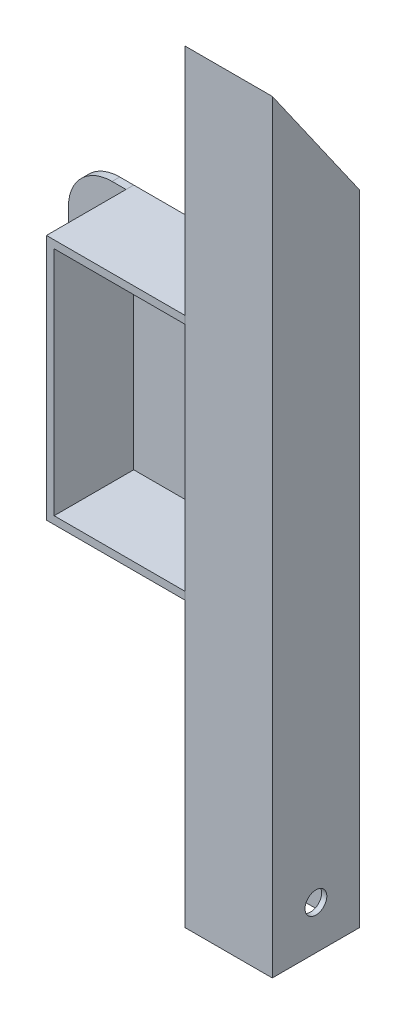
ISO-10303-21;
HEADER;
FILE_DESCRIPTION(('STEP AP214'),'2;1');
FILE_NAME('part.step','',(''),(''),'','','');
FILE_SCHEMA(('AUTOMOTIVE_DESIGN { 1 0 10303 214 1 1 1 1 }'));
ENDSEC;
DATA;
#1=APPLICATION_CONTEXT('core data for automotive mechanical design processes');
#2=APPLICATION_PROTOCOL_DEFINITION('international standard','automotive_design',2000,#1);
#3=PRODUCT_CONTEXT('',#1,'mechanical');
#4=PRODUCT('Part','Part','',(#3));
#5=PRODUCT_RELATED_PRODUCT_CATEGORY('part','',(#4));
#6=PRODUCT_DEFINITION_FORMATION('','',#4);
#7=PRODUCT_DEFINITION_CONTEXT('part definition',#1,'design');
#8=PRODUCT_DEFINITION('design','',#6,#7);
#9=PRODUCT_DEFINITION_SHAPE('','',#8);
#10=(LENGTH_UNIT() NAMED_UNIT(*) SI_UNIT(.MILLI.,.METRE.));
#11=(NAMED_UNIT(*) PLANE_ANGLE_UNIT() SI_UNIT($,.RADIAN.));
#12=(NAMED_UNIT(*) SI_UNIT($,.STERADIAN.) SOLID_ANGLE_UNIT());
#13=UNCERTAINTY_MEASURE_WITH_UNIT(LENGTH_MEASURE(1.E-05),#10,'distance_accuracy_value','');
#14=(GEOMETRIC_REPRESENTATION_CONTEXT(3) GLOBAL_UNCERTAINTY_ASSIGNED_CONTEXT((#13)) GLOBAL_UNIT_ASSIGNED_CONTEXT((#10,
#11,#12)) REPRESENTATION_CONTEXT('',''));
#15=CARTESIAN_POINT('',(0.,0.,0.));
#16=DIRECTION('',(0.,0.,1.));
#17=DIRECTION('',(1.,0.,0.));
#18=AXIS2_PLACEMENT_3D('',#15,#16,#17);
#19=CARTESIAN_POINT('',(-40.3352,154.3304,-23.1648));
#20=DIRECTION('',(1.,0.,0.));
#21=DIRECTION('',(0.,1.,0.));
#22=AXIS2_PLACEMENT_3D('',#19,#20,#21);
#23=PLANE('',#22);
#24=DIRECTION('',(0.,-1.,0.));
#25=VECTOR('',#24,1.);
#26=CARTESIAN_POINT('',(-40.3352,154.3304,-25.4));
#27=LINE('',#26,#25);
#28=CARTESIAN_POINT('',(-40.3352,154.3304,-25.4));
#29=VERTEX_POINT('',#28);
#30=CARTESIAN_POINT('',(-40.3352,82.55,-25.4));
#31=VERTEX_POINT('',#30);
#32=EDGE_CURVE('E135',#29,#31,#27,.T.);
#33=ORIENTED_EDGE('',*,*,#32,.F.);
#34=DIRECTION('',(0.,0.,-1.));
#35=VECTOR('',#34,1.);
#36=CARTESIAN_POINT('',(-40.3352,154.3304,-23.1648));
#37=LINE('',#36,#35);
#38=CARTESIAN_POINT('',(-40.3352,154.3304,-23.1648));
#39=VERTEX_POINT('',#38);
#40=EDGE_CURVE('E12',#39,#29,#37,.T.);
#41=ORIENTED_EDGE('',*,*,#40,.F.);
#42=DIRECTION('',(0.,-1.,0.));
#43=VECTOR('',#42,1.);
#44=CARTESIAN_POINT('',(-40.3352,154.3304,-23.1648));
#45=LINE('',#44,#43);
#46=CARTESIAN_POINT('',(-40.3352,82.55,-23.1648));
#47=VERTEX_POINT('',#46);
#48=EDGE_CURVE('E150',#39,#47,#45,.T.);
#49=ORIENTED_EDGE('',*,*,#48,.T.);
#50=DIRECTION('',(0.,0.,-1.));
#51=VECTOR('',#50,1.);
#52=CARTESIAN_POINT('',(-40.3352,82.55,-23.1648));
#53=LINE('',#52,#51);
#54=EDGE_CURVE('E53',#47,#31,#53,.T.);
#55=ORIENTED_EDGE('',*,*,#54,.T.);
#56=EDGE_LOOP('',(#33,#41,#49,#55));
#57=FACE_BOUND('',#56,.T.);
#58=ADVANCED_FACE('F50',(#57),#23,.T.);
#59=CARTESIAN_POINT('',(-40.3352,154.3304,-23.1648));
#60=DIRECTION('',(0.,1.,0.));
#61=DIRECTION('',(0.,0.,1.));
#62=AXIS2_PLACEMENT_3D('',#59,#60,#61);
#63=PLANE('',#62);
#64=DIRECTION('',(1.,0.,0.));
#65=VECTOR('',#64,1.);
#66=CARTESIAN_POINT('',(-40.3352,154.3304,-25.4));
#67=LINE('',#66,#65);
#68=CARTESIAN_POINT('',(-44.3991999999999,154.3304,-25.4));
#69=VERTEX_POINT('',#68);
#70=EDGE_CURVE('E148',#69,#29,#67,.T.);
#71=ORIENTED_EDGE('',*,*,#70,.F.);
#72=DIRECTION('',(0.,0.,-1.));
#73=VECTOR('',#72,1.);
#74=CARTESIAN_POINT('',(-44.3991999999999,154.3304,-23.1648));
#75=LINE('',#74,#73);
#76=CARTESIAN_POINT('',(-44.3991999999999,154.3304,-23.1648));
#77=VERTEX_POINT('',#76);
#78=EDGE_CURVE('E59',#77,#69,#75,.T.);
#79=ORIENTED_EDGE('',*,*,#78,.F.);
#80=DIRECTION('',(1.,0.,0.));
#81=VECTOR('',#80,1.);
#82=CARTESIAN_POINT('',(-40.3352,154.3304,-23.1648));
#83=LINE('',#82,#81);
#84=EDGE_CURVE('E125',#77,#39,#83,.T.);
#85=ORIENTED_EDGE('',*,*,#84,.T.);
#86=ORIENTED_EDGE('',*,*,#40,.T.);
#87=EDGE_LOOP('',(#71,#79,#85,#86));
#88=FACE_BOUND('',#87,.T.);
#89=ADVANCED_FACE('F158',(#88),#63,.T.);
#90=CARTESIAN_POINT('',(-44.3992,141.6304,-23.1648));
#91=DIRECTION('',(0.,0.,-1.));
#92=DIRECTION('',(-1.,0.,0.));
#93=AXIS2_PLACEMENT_3D('',#90,#91,#92);
#94=CYLINDRICAL_SURFACE('',#93,12.7);
#95=CARTESIAN_POINT('',(-44.3992,141.6304,-25.4));
#96=DIRECTION('',(0.,0.,-1.));
#97=DIRECTION('',(-1.,0.,0.));
#98=AXIS2_PLACEMENT_3D('',#95,#96,#97);
#99=CIRCLE('',#98,12.7);
#100=CARTESIAN_POINT('',(-57.0991999999999,141.6304,-25.4));
#101=VERTEX_POINT('',#100);
#102=EDGE_CURVE('E112',#101,#69,#99,.T.);
#103=ORIENTED_EDGE('',*,*,#102,.F.);
#104=DIRECTION('',(0.,0.,-1.));
#105=VECTOR('',#104,1.);
#106=CARTESIAN_POINT('',(-57.0991999999999,141.6304,-23.1648));
#107=LINE('',#106,#105);
#108=CARTESIAN_POINT('',(-57.0991999999999,141.6304,-23.1648));
#109=VERTEX_POINT('',#108);
#110=EDGE_CURVE('E107',#109,#101,#107,.T.);
#111=ORIENTED_EDGE('',*,*,#110,.F.);
#112=CARTESIAN_POINT('',(-44.3992,141.6304,-23.1648));
#113=DIRECTION('',(0.,0.,-1.));
#114=DIRECTION('',(-1.,0.,0.));
#115=AXIS2_PLACEMENT_3D('',#112,#113,#114);
#116=CIRCLE('',#115,12.7);
#117=EDGE_CURVE('E110',#109,#77,#116,.T.);
#118=ORIENTED_EDGE('',*,*,#117,.T.);
#119=ORIENTED_EDGE('',*,*,#78,.T.);
#120=EDGE_LOOP('',(#103,#111,#118,#119));
#121=FACE_BOUND('',#120,.T.);
#122=ADVANCED_FACE('F109',(#121),#94,.T.);
#123=CARTESIAN_POINT('',(-57.0992,141.6304,-23.1648));
#124=DIRECTION('',(-1.,0.,0.));
#125=DIRECTION('',(0.,-1.,0.));
#126=AXIS2_PLACEMENT_3D('',#123,#124,#125);
#127=PLANE('',#126);
#128=DIRECTION('',(0.,1.,0.));
#129=VECTOR('',#128,1.);
#130=CARTESIAN_POINT('',(-57.0992,141.6304,-25.4));
#131=LINE('',#130,#129);
#132=CARTESIAN_POINT('',(-57.0992,95.2500000000001,-25.4));
#133=VERTEX_POINT('',#132);
#134=EDGE_CURVE('E145',#133,#101,#131,.T.);
#135=ORIENTED_EDGE('',*,*,#134,.F.);
#136=DIRECTION('',(0.,0.,-1.));
#137=VECTOR('',#136,1.);
#138=CARTESIAN_POINT('',(-57.0992,95.2500000000001,-23.1648));
#139=LINE('',#138,#137);
#140=CARTESIAN_POINT('',(-57.0992,95.2500000000001,-23.1648));
#141=VERTEX_POINT('',#140);
#142=EDGE_CURVE('E117',#141,#133,#139,.T.);
#143=ORIENTED_EDGE('',*,*,#142,.F.);
#144=DIRECTION('',(0.,1.,0.));
#145=VECTOR('',#144,1.);
#146=CARTESIAN_POINT('',(-57.0992,141.6304,-23.1648));
#147=LINE('',#146,#145);
#148=EDGE_CURVE('E123',#141,#109,#147,.T.);
#149=ORIENTED_EDGE('',*,*,#148,.T.);
#150=ORIENTED_EDGE('',*,*,#110,.T.);
#151=EDGE_LOOP('',(#135,#143,#149,#150));
#152=FACE_BOUND('',#151,.T.);
#153=ADVANCED_FACE('F127',(#152),#127,.T.);
#154=CARTESIAN_POINT('',(-44.3992,95.25,-23.1648));
#155=DIRECTION('',(0.,0.,-1.));
#156=DIRECTION('',(-1.,0.,0.));
#157=AXIS2_PLACEMENT_3D('',#154,#155,#156);
#158=CYLINDRICAL_SURFACE('',#157,12.7);
#159=CARTESIAN_POINT('',(-44.3992,95.25,-25.4));
#160=DIRECTION('',(0.,0.,-1.));
#161=DIRECTION('',(-1.,0.,0.));
#162=AXIS2_PLACEMENT_3D('',#159,#160,#161);
#163=CIRCLE('',#162,12.7);
#164=CARTESIAN_POINT('',(-44.3991999999999,82.55,-25.4));
#165=VERTEX_POINT('',#164);
#166=EDGE_CURVE('E142',#165,#133,#163,.T.);
#167=ORIENTED_EDGE('',*,*,#166,.F.);
#168=DIRECTION('',(0.,0.,-1.));
#169=VECTOR('',#168,1.);
#170=CARTESIAN_POINT('',(-44.3991999999999,82.55,-23.1648));
#171=LINE('',#170,#169);
#172=CARTESIAN_POINT('',(-44.3991999999999,82.55,-23.1648));
#173=VERTEX_POINT('',#172);
#174=EDGE_CURVE('E153',#173,#165,#171,.T.);
#175=ORIENTED_EDGE('',*,*,#174,.F.);
#176=CARTESIAN_POINT('',(-44.3992,95.25,-23.1648));
#177=DIRECTION('',(0.,0.,-1.));
#178=DIRECTION('',(-1.,0.,0.));
#179=AXIS2_PLACEMENT_3D('',#176,#177,#178);
#180=CIRCLE('',#179,12.7);
#181=EDGE_CURVE('E128',#173,#141,#180,.T.);
#182=ORIENTED_EDGE('',*,*,#181,.T.);
#183=ORIENTED_EDGE('',*,*,#142,.T.);
#184=EDGE_LOOP('',(#167,#175,#182,#183));
#185=FACE_BOUND('',#184,.T.);
#186=ADVANCED_FACE('F171',(#185),#158,.T.);
#187=CARTESIAN_POINT('',(-40.3352,82.55,-23.1648));
#188=DIRECTION('',(0.,-1.,0.));
#189=DIRECTION('',(0.,0.,-1.));
#190=AXIS2_PLACEMENT_3D('',#187,#188,#189);
#191=PLANE('',#190);
#192=DIRECTION('',(-1.,0.,0.));
#193=VECTOR('',#192,1.);
#194=CARTESIAN_POINT('',(-40.3352,82.55,-25.4));
#195=LINE('',#194,#193);
#196=EDGE_CURVE('E138',#31,#165,#195,.T.);
#197=ORIENTED_EDGE('',*,*,#196,.F.);
#198=ORIENTED_EDGE('',*,*,#54,.F.);
#199=DIRECTION('',(-1.,0.,0.));
#200=VECTOR('',#199,1.);
#201=CARTESIAN_POINT('',(-40.3352,82.55,-23.1648));
#202=LINE('',#201,#200);
#203=EDGE_CURVE('E130',#47,#173,#202,.T.);
#204=ORIENTED_EDGE('',*,*,#203,.T.);
#205=ORIENTED_EDGE('',*,*,#174,.T.);
#206=EDGE_LOOP('',(#197,#198,#204,#205));
#207=FACE_BOUND('',#206,.T.);
#208=ADVANCED_FACE('F155',(#207),#191,.T.);
#209=CARTESIAN_POINT('',(-44.3992,95.25,-23.1648));
#210=DIRECTION('',(0.,0.,-1.));
#211=DIRECTION('',(-1.,0.,0.));
#212=AXIS2_PLACEMENT_3D('',#209,#210,#211);
#213=PLANE('',#212);
#214=CARTESIAN_POINT('',(-48.7172,92.1004,-23.1648));
#215=DIRECTION('',(0.,0.,-1.));
#216=DIRECTION('',(-1.,0.,0.));
#217=AXIS2_PLACEMENT_3D('',#214,#215,#216);
#218=CIRCLE('',#217,1.15570000000001);
#219=CARTESIAN_POINT('',(-49.8729,92.1004,-23.1648));
#220=VERTEX_POINT('',#219);
#221=EDGE_CURVE('E209',#220,#220,#218,.T.);
#222=ORIENTED_EDGE('',*,*,#221,.T.);
#223=EDGE_LOOP('',(#222));
#224=FACE_BOUND('',#223,.T.);
#225=CARTESIAN_POINT('',(-48.7172,104.8004,-23.1648));
#226=DIRECTION('',(0.,0.,-1.));
#227=DIRECTION('',(-1.,0.,0.));
#228=AXIS2_PLACEMENT_3D('',#225,#226,#227);
#229=CIRCLE('',#228,1.15570000000001);
#230=CARTESIAN_POINT('',(-49.8729,104.8004,-23.1648));
#231=VERTEX_POINT('',#230);
#232=EDGE_CURVE('E217',#231,#231,#229,.T.);
#233=ORIENTED_EDGE('',*,*,#232,.T.);
#234=EDGE_LOOP('',(#233));
#235=FACE_BOUND('',#234,.T.);
#236=CARTESIAN_POINT('',(-48.7172,117.5004,-23.1648));
#237=DIRECTION('',(0.,0.,-1.));
#238=DIRECTION('',(-1.,0.,0.));
#239=AXIS2_PLACEMENT_3D('',#236,#237,#238);
#240=CIRCLE('',#239,1.15570000000001);
#241=CARTESIAN_POINT('',(-49.8729,117.5004,-23.1648));
#242=VERTEX_POINT('',#241);
#243=EDGE_CURVE('E223',#242,#242,#240,.T.);
#244=ORIENTED_EDGE('',*,*,#243,.T.);
#245=EDGE_LOOP('',(#244));
#246=FACE_BOUND('',#245,.T.);
#247=CARTESIAN_POINT('',(-48.7172,130.2004,-23.1648));
#248=DIRECTION('',(0.,0.,-1.));
#249=DIRECTION('',(-1.,0.,0.));
#250=AXIS2_PLACEMENT_3D('',#247,#248,#249);
#251=CIRCLE('',#250,1.15570000000001);
#252=CARTESIAN_POINT('',(-49.8729,130.2004,-23.1648));
#253=VERTEX_POINT('',#252);
#254=EDGE_CURVE('E229',#253,#253,#251,.T.);
#255=ORIENTED_EDGE('',*,*,#254,.T.);
#256=EDGE_LOOP('',(#255));
#257=FACE_BOUND('',#256,.T.);
#258=CARTESIAN_POINT('',(-48.7172,142.9004,-23.1648));
#259=DIRECTION('',(0.,0.,-1.));
#260=DIRECTION('',(-1.,0.,0.));
#261=AXIS2_PLACEMENT_3D('',#258,#259,#260);
#262=CIRCLE('',#261,1.15570000000001);
#263=CARTESIAN_POINT('',(-49.8729,142.9004,-23.1648));
#264=VERTEX_POINT('',#263);
#265=EDGE_CURVE('E139',#264,#264,#262,.T.);
#266=ORIENTED_EDGE('',*,*,#265,.T.);
#267=EDGE_LOOP('',(#266));
#268=FACE_BOUND('',#267,.T.);
#269=ORIENTED_EDGE('',*,*,#48,.F.);
#270=ORIENTED_EDGE('',*,*,#84,.F.);
#271=ORIENTED_EDGE('',*,*,#117,.F.);
#272=ORIENTED_EDGE('',*,*,#148,.F.);
#273=ORIENTED_EDGE('',*,*,#181,.F.);
#274=ORIENTED_EDGE('',*,*,#203,.F.);
#275=EDGE_LOOP('',(#269,#270,#271,#272,#273,#274));
#276=FACE_BOUND('',#275,.T.);
#277=ADVANCED_FACE('F121',(#224,#235,#246,#257,#268,#276),#213,.F.);
#278=CARTESIAN_POINT('',(-44.3992,95.25,-25.4));
#279=DIRECTION('',(0.,0.,-1.));
#280=DIRECTION('',(-1.,0.,0.));
#281=AXIS2_PLACEMENT_3D('',#278,#279,#280);
#282=PLANE('',#281);
#283=CARTESIAN_POINT('',(-48.7172,92.1004,-25.4));
#284=DIRECTION('',(0.,0.,-1.));
#285=DIRECTION('',(-1.,0.,0.));
#286=AXIS2_PLACEMENT_3D('',#283,#284,#285);
#287=CIRCLE('',#286,1.15570000000001);
#288=CARTESIAN_POINT('',(-49.8729,92.1004,-25.4));
#289=VERTEX_POINT('',#288);
#290=EDGE_CURVE('E212',#289,#289,#287,.T.);
#291=ORIENTED_EDGE('',*,*,#290,.F.);
#292=EDGE_LOOP('',(#291));
#293=FACE_BOUND('',#292,.T.);
#294=CARTESIAN_POINT('',(-48.7172,104.8004,-25.4));
#295=DIRECTION('',(0.,0.,-1.));
#296=DIRECTION('',(-1.,0.,0.));
#297=AXIS2_PLACEMENT_3D('',#294,#295,#296);
#298=CIRCLE('',#297,1.15570000000001);
#299=CARTESIAN_POINT('',(-49.8729,104.8004,-25.4));
#300=VERTEX_POINT('',#299);
#301=EDGE_CURVE('E214',#300,#300,#298,.T.);
#302=ORIENTED_EDGE('',*,*,#301,.F.);
#303=EDGE_LOOP('',(#302));
#304=FACE_BOUND('',#303,.T.);
#305=CARTESIAN_POINT('',(-48.7172,117.5004,-25.4));
#306=DIRECTION('',(0.,0.,-1.));
#307=DIRECTION('',(-1.,0.,0.));
#308=AXIS2_PLACEMENT_3D('',#305,#306,#307);
#309=CIRCLE('',#308,1.15570000000001);
#310=CARTESIAN_POINT('',(-49.8729,117.5004,-25.4));
#311=VERTEX_POINT('',#310);
#312=EDGE_CURVE('E220',#311,#311,#309,.T.);
#313=ORIENTED_EDGE('',*,*,#312,.F.);
#314=EDGE_LOOP('',(#313));
#315=FACE_BOUND('',#314,.T.);
#316=CARTESIAN_POINT('',(-48.7172,130.2004,-25.4));
#317=DIRECTION('',(0.,0.,-1.));
#318=DIRECTION('',(-1.,0.,0.));
#319=AXIS2_PLACEMENT_3D('',#316,#317,#318);
#320=CIRCLE('',#319,1.15570000000001);
#321=CARTESIAN_POINT('',(-49.8729,130.2004,-25.4));
#322=VERTEX_POINT('',#321);
#323=EDGE_CURVE('E226',#322,#322,#320,.T.);
#324=ORIENTED_EDGE('',*,*,#323,.F.);
#325=EDGE_LOOP('',(#324));
#326=FACE_BOUND('',#325,.T.);
#327=CARTESIAN_POINT('',(-48.7172,142.9004,-25.4));
#328=DIRECTION('',(0.,0.,-1.));
#329=DIRECTION('',(-1.,0.,0.));
#330=AXIS2_PLACEMENT_3D('',#327,#328,#329);
#331=CIRCLE('',#330,1.15570000000001);
#332=CARTESIAN_POINT('',(-49.8729,142.9004,-25.4));
#333=VERTEX_POINT('',#332);
#334=EDGE_CURVE('E232',#333,#333,#331,.T.);
#335=ORIENTED_EDGE('',*,*,#334,.F.);
#336=EDGE_LOOP('',(#335));
#337=FACE_BOUND('',#336,.T.);
#338=ORIENTED_EDGE('',*,*,#32,.T.);
#339=ORIENTED_EDGE('',*,*,#196,.T.);
#340=ORIENTED_EDGE('',*,*,#166,.T.);
#341=ORIENTED_EDGE('',*,*,#134,.T.);
#342=ORIENTED_EDGE('',*,*,#102,.T.);
#343=ORIENTED_EDGE('',*,*,#70,.T.);
#344=EDGE_LOOP('',(#338,#339,#340,#341,#342,#343));
#345=FACE_BOUND('',#344,.T.);
#346=ADVANCED_FACE('F157',(#293,#304,#315,#326,#337,#345),#282,.T.);
#347=CARTESIAN_POINT('',(-48.7172,142.9004,-23.1648));
#348=DIRECTION('',(0.,0.,-1.));
#349=DIRECTION('',(-1.,0.,0.));
#350=AXIS2_PLACEMENT_3D('',#347,#348,#349);
#351=CYLINDRICAL_SURFACE('',#350,1.15570000000001);
#352=ORIENTED_EDGE('',*,*,#265,.F.);
#353=EDGE_LOOP('',(#352));
#354=FACE_BOUND('',#353,.T.);
#355=ORIENTED_EDGE('',*,*,#334,.T.);
#356=EDGE_LOOP('',(#355));
#357=FACE_BOUND('',#356,.T.);
#358=ADVANCED_FACE('F182',(#354,#357),#351,.F.);
#359=CARTESIAN_POINT('',(-48.7172,130.2004,-23.1648));
#360=DIRECTION('',(0.,0.,-1.));
#361=DIRECTION('',(-1.,0.,0.));
#362=AXIS2_PLACEMENT_3D('',#359,#360,#361);
#363=CYLINDRICAL_SURFACE('',#362,1.15570000000001);
#364=ORIENTED_EDGE('',*,*,#254,.F.);
#365=EDGE_LOOP('',(#364));
#366=FACE_BOUND('',#365,.T.);
#367=ORIENTED_EDGE('',*,*,#323,.T.);
#368=EDGE_LOOP('',(#367));
#369=FACE_BOUND('',#368,.T.);
#370=ADVANCED_FACE('F189',(#366,#369),#363,.F.);
#371=CARTESIAN_POINT('',(-48.7172,117.5004,-23.1648));
#372=DIRECTION('',(0.,0.,-1.));
#373=DIRECTION('',(-1.,0.,0.));
#374=AXIS2_PLACEMENT_3D('',#371,#372,#373);
#375=CYLINDRICAL_SURFACE('',#374,1.15570000000001);
#376=ORIENTED_EDGE('',*,*,#243,.F.);
#377=EDGE_LOOP('',(#376));
#378=FACE_BOUND('',#377,.T.);
#379=ORIENTED_EDGE('',*,*,#312,.T.);
#380=EDGE_LOOP('',(#379));
#381=FACE_BOUND('',#380,.T.);
#382=ADVANCED_FACE('F193',(#378,#381),#375,.F.);
#383=CARTESIAN_POINT('',(-48.7172,104.8004,-23.1648));
#384=DIRECTION('',(0.,0.,-1.));
#385=DIRECTION('',(-1.,0.,0.));
#386=AXIS2_PLACEMENT_3D('',#383,#384,#385);
#387=CYLINDRICAL_SURFACE('',#386,1.15570000000001);
#388=ORIENTED_EDGE('',*,*,#232,.F.);
#389=EDGE_LOOP('',(#388));
#390=FACE_BOUND('',#389,.T.);
#391=ORIENTED_EDGE('',*,*,#301,.T.);
#392=EDGE_LOOP('',(#391));
#393=FACE_BOUND('',#392,.T.);
#394=ADVANCED_FACE('F197',(#390,#393),#387,.F.);
#395=CARTESIAN_POINT('',(-48.7172,92.1004,-23.1648));
#396=DIRECTION('',(0.,0.,-1.));
#397=DIRECTION('',(-1.,0.,0.));
#398=AXIS2_PLACEMENT_3D('',#395,#396,#397);
#399=CYLINDRICAL_SURFACE('',#398,1.15570000000001);
#400=ORIENTED_EDGE('',*,*,#221,.F.);
#401=EDGE_LOOP('',(#400));
#402=FACE_BOUND('',#401,.T.);
#403=ORIENTED_EDGE('',*,*,#290,.T.);
#404=EDGE_LOOP('',(#403));
#405=FACE_BOUND('',#404,.T.);
#406=ADVANCED_FACE('F201',(#402,#405),#399,.F.);
#407=CLOSED_SHELL('',(#58,#89,#122,#153,#186,#208,#277,#346,#358,#370,#382,#394,#406));
#408=MANIFOLD_SOLID_BREP('B2',#407);
#409=CARTESIAN_POINT('',(0.,154.3304,82.3368336967119));
#410=DIRECTION('',(1.,0.,0.));
#411=DIRECTION('',(0.,1.,0.));
#412=AXIS2_PLACEMENT_3D('',#409,#410,#411);
#413=PLANE('',#412);
#414=DIRECTION('',(0.,-1.,0.));
#415=VECTOR('',#414,1.);
#416=CARTESIAN_POINT('',(0.,152.0952,-23.1648));
#417=LINE('',#416,#415);
#418=CARTESIAN_POINT('',(0.,152.0952,-23.1648));
#419=VERTEX_POINT('',#418);
#420=CARTESIAN_POINT('',(0.,84.7852,-23.1648));
#421=VERTEX_POINT('',#420);
#422=EDGE_CURVE('E405',#419,#421,#417,.T.);
#423=ORIENTED_EDGE('',*,*,#422,.T.);
#424=DIRECTION('',(0.,0.,1.));
#425=VECTOR('',#424,1.);
#426=CARTESIAN_POINT('',(0.,84.7852,-102.744981091212));
#427=LINE('',#426,#425);
#428=CARTESIAN_POINT('',(0.,84.7852,0.));
#429=VERTEX_POINT('',#428);
#430=EDGE_CURVE('E429',#421,#429,#427,.T.);
#431=ORIENTED_EDGE('',*,*,#430,.T.);
#432=DIRECTION('',(0.,1.,0.));
#433=VECTOR('',#432,1.);
#434=CARTESIAN_POINT('',(0.,154.3304,0.));
#435=LINE('',#434,#433);
#436=CARTESIAN_POINT('',(0.,82.55,0.));
#437=VERTEX_POINT('',#436);
#438=EDGE_CURVE('E347',#437,#429,#435,.T.);
#439=ORIENTED_EDGE('',*,*,#438,.F.);
#440=DIRECTION('',(0.,0.,-1.));
#441=VECTOR('',#440,1.);
#442=CARTESIAN_POINT('',(0.,82.55,82.3368336967119));
#443=LINE('',#442,#441);
#444=CARTESIAN_POINT('',(0.,82.55,-25.4));
#445=VERTEX_POINT('',#444);
#446=EDGE_CURVE('E450',#437,#445,#443,.T.);
#447=ORIENTED_EDGE('',*,*,#446,.T.);
#448=DIRECTION('',(0.,-1.,0.));
#449=VECTOR('',#448,1.);
#450=CARTESIAN_POINT('',(0.,154.3304,-25.4));
#451=LINE('',#450,#449);
#452=CARTESIAN_POINT('',(0.,154.3304,-25.4));
#453=VERTEX_POINT('',#452);
#454=EDGE_CURVE('E438',#453,#445,#451,.T.);
#455=ORIENTED_EDGE('',*,*,#454,.F.);
#456=DIRECTION('',(0.,0.,-1.));
#457=VECTOR('',#456,1.);
#458=CARTESIAN_POINT('',(0.,154.3304,82.3368336967119));
#459=LINE('',#458,#457);
#460=CARTESIAN_POINT('',(0.,154.3304,0.));
#461=VERTEX_POINT('',#460);
#462=EDGE_CURVE('E434',#461,#453,#459,.T.);
#463=ORIENTED_EDGE('',*,*,#462,.F.);
#464=CARTESIAN_POINT('',(0.,152.0952,0.));
#465=VERTEX_POINT('',#464);
#466=EDGE_CURVE('E422',#465,#461,#435,.T.);
#467=ORIENTED_EDGE('',*,*,#466,.F.);
#468=DIRECTION('',(0.,0.,1.));
#469=VECTOR('',#468,1.);
#470=CARTESIAN_POINT('',(0.,152.0952,-102.744981091212));
#471=LINE('',#470,#469);
#472=EDGE_CURVE('E354',#419,#465,#471,.T.);
#473=ORIENTED_EDGE('',*,*,#472,.F.);
#474=EDGE_LOOP('',(#423,#431,#439,#447,#455,#463,#467,#473));
#475=FACE_BOUND('',#474,.T.);
#476=ADVANCED_FACE('F340',(#475),#413,.T.);
#477=CARTESIAN_POINT('',(0.,222.25,0.));
#478=DIRECTION('',(0.,0.,-1.));
#479=DIRECTION('',(-1.,0.,0.));
#480=AXIS2_PLACEMENT_3D('',#477,#478,#479);
#481=PLANE('',#480);
#482=DIRECTION('',(-1.,0.,0.));
#483=VECTOR('',#482,1.);
#484=CARTESIAN_POINT('',(0.,84.7852,0.));
#485=LINE('',#484,#483);
#486=CARTESIAN_POINT('',(-38.0999999999999,84.7852,0.));
#487=VERTEX_POINT('',#486);
#488=EDGE_CURVE('E431',#429,#487,#485,.T.);
#489=ORIENTED_EDGE('',*,*,#488,.T.);
#490=DIRECTION('',(0.,-1.,0.));
#491=VECTOR('',#490,1.);
#492=CARTESIAN_POINT('',(-38.1,152.0952,0.));
#493=LINE('',#492,#491);
#494=CARTESIAN_POINT('',(-38.1,152.0952,0.));
#495=VERTEX_POINT('',#494);
#496=EDGE_CURVE('E413',#495,#487,#493,.T.);
#497=ORIENTED_EDGE('',*,*,#496,.F.);
#498=DIRECTION('',(-1.,0.,0.));
#499=VECTOR('',#498,1.);
#500=CARTESIAN_POINT('',(0.,152.0952,0.));
#501=LINE('',#500,#499);
#502=EDGE_CURVE('E423',#465,#495,#501,.T.);
#503=ORIENTED_EDGE('',*,*,#502,.F.);
#504=ORIENTED_EDGE('',*,*,#466,.T.);
#505=DIRECTION('',(-1.,0.,0.));
#506=VECTOR('',#505,1.);
#507=CARTESIAN_POINT('',(0.,154.3304,0.));
#508=LINE('',#507,#506);
#509=CARTESIAN_POINT('',(-40.3352,154.3304,0.));
#510=VERTEX_POINT('',#509);
#511=EDGE_CURVE('E363',#461,#510,#508,.T.);
#512=ORIENTED_EDGE('',*,*,#511,.T.);
#513=DIRECTION('',(0.,-1.,0.));
#514=VECTOR('',#513,1.);
#515=CARTESIAN_POINT('',(-40.3352,154.3304,0.));
#516=LINE('',#515,#514);
#517=CARTESIAN_POINT('',(-40.3352,82.55,0.));
#518=VERTEX_POINT('',#517);
#519=EDGE_CURVE('E432',#510,#518,#516,.T.);
#520=ORIENTED_EDGE('',*,*,#519,.T.);
#521=DIRECTION('',(1.,0.,0.));
#522=VECTOR('',#521,1.);
#523=CARTESIAN_POINT('',(0.,82.55,0.));
#524=LINE('',#523,#522);
#525=EDGE_CURVE('E48',#518,#437,#524,.T.);
#526=ORIENTED_EDGE('',*,*,#525,.T.);
#527=ORIENTED_EDGE('',*,*,#438,.T.);
#528=EDGE_LOOP('',(#489,#497,#503,#504,#512,#520,#526,#527));
#529=FACE_BOUND('',#528,.T.);
#530=ADVANCED_FACE('F473',(#529),#481,.F.);
#531=CARTESIAN_POINT('',(0.,154.3304,82.3368336967119));
#532=DIRECTION('',(0.,1.,0.));
#533=DIRECTION('',(0.,0.,1.));
#534=AXIS2_PLACEMENT_3D('',#531,#532,#533);
#535=PLANE('',#534);
#536=ORIENTED_EDGE('',*,*,#511,.F.);
#537=ORIENTED_EDGE('',*,*,#462,.T.);
#538=DIRECTION('',(1.,0.,0.));
#539=VECTOR('',#538,1.);
#540=CARTESIAN_POINT('',(0.,154.3304,-25.4));
#541=LINE('',#540,#539);
#542=CARTESIAN_POINT('',(-40.3352,154.3304,-25.4));
#543=VERTEX_POINT('',#542);
#544=EDGE_CURVE('E447',#543,#453,#541,.T.);
#545=ORIENTED_EDGE('',*,*,#544,.F.);
#546=DIRECTION('',(0.,0.,-1.));
#547=VECTOR('',#546,1.);
#548=CARTESIAN_POINT('',(-40.3352,154.3304,82.3368336967119));
#549=LINE('',#548,#547);
#550=EDGE_CURVE('E452',#510,#543,#549,.T.);
#551=ORIENTED_EDGE('',*,*,#550,.F.);
#552=EDGE_LOOP('',(#536,#537,#545,#551));
#553=FACE_BOUND('',#552,.T.);
#554=ADVANCED_FACE('F469',(#553),#535,.T.);
#555=CARTESIAN_POINT('',(-40.3352,154.3304,82.3368336967119));
#556=DIRECTION('',(-1.,0.,0.));
#557=DIRECTION('',(0.,-1.,0.));
#558=AXIS2_PLACEMENT_3D('',#555,#556,#557);
#559=PLANE('',#558);
#560=ORIENTED_EDGE('',*,*,#519,.F.);
#561=ORIENTED_EDGE('',*,*,#550,.T.);
#562=DIRECTION('',(0.,1.,0.));
#563=VECTOR('',#562,1.);
#564=CARTESIAN_POINT('',(-40.3352,154.3304,-25.4));
#565=LINE('',#564,#563);
#566=CARTESIAN_POINT('',(-40.3352,82.55,-25.4));
#567=VERTEX_POINT('',#566);
#568=EDGE_CURVE('E444',#567,#543,#565,.T.);
#569=ORIENTED_EDGE('',*,*,#568,.F.);
#570=DIRECTION('',(0.,0.,-1.));
#571=VECTOR('',#570,1.);
#572=CARTESIAN_POINT('',(-40.3352,82.55,82.3368336967119));
#573=LINE('',#572,#571);
#574=EDGE_CURVE('E454',#518,#567,#573,.T.);
#575=ORIENTED_EDGE('',*,*,#574,.F.);
#576=EDGE_LOOP('',(#560,#561,#569,#575));
#577=FACE_BOUND('',#576,.T.);
#578=ADVANCED_FACE('F471',(#577),#559,.T.);
#579=CARTESIAN_POINT('',(0.,82.55,82.3368336967119));
#580=DIRECTION('',(0.,-1.,0.));
#581=DIRECTION('',(0.,0.,-1.));
#582=AXIS2_PLACEMENT_3D('',#579,#580,#581);
#583=PLANE('',#582);
#584=ORIENTED_EDGE('',*,*,#525,.F.);
#585=ORIENTED_EDGE('',*,*,#574,.T.);
#586=DIRECTION('',(-1.,0.,0.));
#587=VECTOR('',#586,1.);
#588=CARTESIAN_POINT('',(0.,82.55,-25.4));
#589=LINE('',#588,#587);
#590=EDGE_CURVE('E441',#445,#567,#589,.T.);
#591=ORIENTED_EDGE('',*,*,#590,.F.);
#592=ORIENTED_EDGE('',*,*,#446,.F.);
#593=EDGE_LOOP('',(#584,#585,#591,#592));
#594=FACE_BOUND('',#593,.T.);
#595=ADVANCED_FACE('F461',(#594),#583,.T.);
#596=CARTESIAN_POINT('',(0.,0.,-25.4));
#597=DIRECTION('',(0.,0.,-1.));
#598=DIRECTION('',(-1.,0.,0.));
#599=AXIS2_PLACEMENT_3D('',#596,#597,#598);
#600=PLANE('',#599);
#601=ORIENTED_EDGE('',*,*,#454,.T.);
#602=ORIENTED_EDGE('',*,*,#590,.T.);
#603=ORIENTED_EDGE('',*,*,#568,.T.);
#604=ORIENTED_EDGE('',*,*,#544,.T.);
#605=EDGE_LOOP('',(#601,#602,#603,#604));
#606=FACE_BOUND('',#605,.T.);
#607=ADVANCED_FACE('F465',(#606),#600,.T.);
#608=CARTESIAN_POINT('',(0.,84.7852,-102.744981091212));
#609=DIRECTION('',(0.,1.,0.));
#610=DIRECTION('',(0.,0.,1.));
#611=AXIS2_PLACEMENT_3D('',#608,#609,#610);
#612=PLANE('',#611);
#613=DIRECTION('',(-1.,0.,0.));
#614=VECTOR('',#613,1.);
#615=CARTESIAN_POINT('',(0.,84.7852,-23.1648));
#616=LINE('',#615,#614);
#617=CARTESIAN_POINT('',(-38.0999999999999,84.7852,-23.1648));
#618=VERTEX_POINT('',#617);
#619=EDGE_CURVE('E410',#421,#618,#616,.T.);
#620=ORIENTED_EDGE('',*,*,#619,.T.);
#621=DIRECTION('',(0.,0.,1.));
#622=VECTOR('',#621,1.);
#623=CARTESIAN_POINT('',(-38.0999999999999,84.7852,-102.744981091212));
#624=LINE('',#623,#622);
#625=EDGE_CURVE('E418',#618,#487,#624,.T.);
#626=ORIENTED_EDGE('',*,*,#625,.T.);
#627=ORIENTED_EDGE('',*,*,#488,.F.);
#628=ORIENTED_EDGE('',*,*,#430,.F.);
#629=EDGE_LOOP('',(#620,#626,#627,#628));
#630=FACE_BOUND('',#629,.T.);
#631=ADVANCED_FACE('F483',(#630),#612,.T.);
#632=CARTESIAN_POINT('',(-38.1,152.0952,-102.744981091212));
#633=DIRECTION('',(-1.,0.,0.));
#634=DIRECTION('',(0.,-1.,0.));
#635=AXIS2_PLACEMENT_3D('',#632,#633,#634);
#636=PLANE('',#635);
#637=DIRECTION('',(0.,0.,1.));
#638=VECTOR('',#637,1.);
#639=CARTESIAN_POINT('',(-38.1,152.0952,-102.744981091212));
#640=LINE('',#639,#638);
#641=CARTESIAN_POINT('',(-38.1,152.0952,-23.1648));
#642=VERTEX_POINT('',#641);
#643=EDGE_CURVE('E416',#642,#495,#640,.T.);
#644=ORIENTED_EDGE('',*,*,#643,.T.);
#645=ORIENTED_EDGE('',*,*,#496,.T.);
#646=ORIENTED_EDGE('',*,*,#625,.F.);
#647=DIRECTION('',(0.,-1.,0.));
#648=VECTOR('',#647,1.);
#649=CARTESIAN_POINT('',(-38.1,152.0952,-23.1648));
#650=LINE('',#649,#648);
#651=EDGE_CURVE('E477',#642,#618,#650,.T.);
#652=ORIENTED_EDGE('',*,*,#651,.F.);
#653=EDGE_LOOP('',(#644,#645,#646,#652));
#654=FACE_BOUND('',#653,.T.);
#655=ADVANCED_FACE('F485',(#654),#636,.F.);
#656=CARTESIAN_POINT('',(0.,152.0952,-102.744981091212));
#657=DIRECTION('',(0.,1.,0.));
#658=DIRECTION('',(0.,0.,1.));
#659=AXIS2_PLACEMENT_3D('',#656,#657,#658);
#660=PLANE('',#659);
#661=ORIENTED_EDGE('',*,*,#472,.T.);
#662=ORIENTED_EDGE('',*,*,#502,.T.);
#663=ORIENTED_EDGE('',*,*,#643,.F.);
#664=DIRECTION('',(-1.,0.,0.));
#665=VECTOR('',#664,1.);
#666=CARTESIAN_POINT('',(0.,152.0952,-23.1648));
#667=LINE('',#666,#665);
#668=EDGE_CURVE('E407',#419,#642,#667,.T.);
#669=ORIENTED_EDGE('',*,*,#668,.F.);
#670=EDGE_LOOP('',(#661,#662,#663,#669));
#671=FACE_BOUND('',#670,.T.);
#672=ADVANCED_FACE('F415',(#671),#660,.F.);
#673=CARTESIAN_POINT('',(0.,0.,-23.1648));
#674=DIRECTION('',(0.,0.,-1.));
#675=DIRECTION('',(-1.,0.,0.));
#676=AXIS2_PLACEMENT_3D('',#673,#674,#675);
#677=PLANE('',#676);
#678=ORIENTED_EDGE('',*,*,#422,.F.);
#679=ORIENTED_EDGE('',*,*,#668,.T.);
#680=ORIENTED_EDGE('',*,*,#651,.T.);
#681=ORIENTED_EDGE('',*,*,#619,.F.);
#682=EDGE_LOOP('',(#678,#679,#680,#681));
#683=FACE_BOUND('',#682,.T.);
#684=ADVANCED_FACE('F406',(#683),#677,.F.);
#685=CLOSED_SHELL('',(#476,#530,#554,#578,#595,#607,#631,#655,#672,#684));
#686=MANIFOLD_SOLID_BREP('B6',#685);
#687=CARTESIAN_POINT('',(-57.0992,12.7,-12.7));
#688=DIRECTION('',(1.,0.,0.));
#689=DIRECTION('',(0.,0.,-1.));
#690=AXIS2_PLACEMENT_3D('',#687,#688,#689);
#691=CYLINDRICAL_SURFACE('',#690,3.175);
#692=CARTESIAN_POINT('',(23.876,12.7,-12.7));
#693=DIRECTION('',(1.,0.,0.));
#694=DIRECTION('',(0.,0.,-1.));
#695=AXIS2_PLACEMENT_3D('',#692,#693,#694);
#696=CIRCLE('',#695,3.175);
#697=CARTESIAN_POINT('',(23.876,12.7,-15.875));
#698=VERTEX_POINT('',#697);
#699=EDGE_CURVE('E670',#698,#698,#696,.F.);
#700=ORIENTED_EDGE('',*,*,#699,.T.);
#701=EDGE_LOOP('',(#700));
#702=FACE_BOUND('',#701,.T.);
#703=CARTESIAN_POINT('',(25.4,12.7,-12.7));
#704=DIRECTION('',(1.,0.,0.));
#705=DIRECTION('',(0.,0.,-1.));
#706=AXIS2_PLACEMENT_3D('',#703,#704,#705);
#707=CIRCLE('',#706,3.175);
#708=CARTESIAN_POINT('',(25.4,12.7,-15.875));
#709=VERTEX_POINT('',#708);
#710=EDGE_CURVE('E675',#709,#709,#707,.T.);
#711=ORIENTED_EDGE('',*,*,#710,.T.);
#712=EDGE_LOOP('',(#711));
#713=FACE_BOUND('',#712,.T.);
#714=ADVANCED_FACE('F566',(#702,#713),#691,.F.);
#715=CARTESIAN_POINT('',(0.,222.25,0.));
#716=DIRECTION('',(1.,0.,0.));
#717=DIRECTION('',(0.,0.,-1.));
#718=AXIS2_PLACEMENT_3D('',#715,#716,#717);
#719=PLANE('',#718);
#720=CARTESIAN_POINT('',(0.,12.7,-12.7));
#721=DIRECTION('',(1.,0.,0.));
#722=DIRECTION('',(0.,0.,-1.));
#723=AXIS2_PLACEMENT_3D('',#720,#721,#722);
#724=CIRCLE('',#723,3.175);
#725=CARTESIAN_POINT('',(0.,12.7,-15.875));
#726=VERTEX_POINT('',#725);
#727=EDGE_CURVE('E679',#726,#726,#724,.T.);
#728=ORIENTED_EDGE('',*,*,#727,.T.);
#729=EDGE_LOOP('',(#728));
#730=FACE_BOUND('',#729,.T.);
#731=DIRECTION('',(0.,-1.,0.));
#732=VECTOR('',#731,1.);
#733=CARTESIAN_POINT('',(0.,222.25,0.));
#734=LINE('',#733,#732);
#735=CARTESIAN_POINT('',(0.,222.25,0.));
#736=VERTEX_POINT('',#735);
#737=CARTESIAN_POINT('',(0.,0.,0.));
#738=VERTEX_POINT('',#737);
#739=EDGE_CURVE('E723',#736,#738,#734,.T.);
#740=ORIENTED_EDGE('',*,*,#739,.F.);
#741=DIRECTION('',(0.,-0.819152044288995,-0.573576436351042));
#742=VECTOR('',#741,1.);
#743=CARTESIAN_POINT('',(0.,185.97504062875,-25.4));
#744=LINE('',#743,#742);
#745=CARTESIAN_POINT('',(0.,185.97504062875,-25.4));
#746=VERTEX_POINT('',#745);
#747=EDGE_CURVE('E683',#736,#746,#744,.T.);
#748=ORIENTED_EDGE('',*,*,#747,.T.);
#749=DIRECTION('',(0.,-1.,0.));
#750=VECTOR('',#749,1.);
#751=CARTESIAN_POINT('',(0.,222.25,-25.4));
#752=LINE('',#751,#750);
#753=CARTESIAN_POINT('',(0.,0.,-25.4));
#754=VERTEX_POINT('',#753);
#755=EDGE_CURVE('E699',#746,#754,#752,.T.);
#756=ORIENTED_EDGE('',*,*,#755,.T.);
#757=DIRECTION('',(0.,0.,1.));
#758=VECTOR('',#757,1.);
#759=CARTESIAN_POINT('',(0.,0.,0.));
#760=LINE('',#759,#758);
#761=EDGE_CURVE('E695',#754,#738,#760,.T.);
#762=ORIENTED_EDGE('',*,*,#761,.T.);
#763=EDGE_LOOP('',(#740,#748,#756,#762));
#764=FACE_BOUND('',#763,.T.);
#765=ADVANCED_FACE('F568',(#730,#764),#719,.F.);
#766=CARTESIAN_POINT('',(0.,222.25,0.));
#767=DIRECTION('',(0.,0.,-1.));
#768=DIRECTION('',(-1.,0.,0.));
#769=AXIS2_PLACEMENT_3D('',#766,#767,#768);
#770=PLANE('',#769);
#771=DIRECTION('',(1.,0.,0.));
#772=VECTOR('',#771,1.);
#773=CARTESIAN_POINT('',(0.,0.,0.));
#774=LINE('',#773,#772);
#775=CARTESIAN_POINT('',(25.4,0.,0.));
#776=VERTEX_POINT('',#775);
#777=EDGE_CURVE('E704',#738,#776,#774,.T.);
#778=ORIENTED_EDGE('',*,*,#777,.T.);
#779=DIRECTION('',(0.,-1.,0.));
#780=VECTOR('',#779,1.);
#781=CARTESIAN_POINT('',(25.4,222.25,0.));
#782=LINE('',#781,#780);
#783=CARTESIAN_POINT('',(25.4,222.25,0.));
#784=VERTEX_POINT('',#783);
#785=EDGE_CURVE('E719',#784,#776,#782,.T.);
#786=ORIENTED_EDGE('',*,*,#785,.F.);
#787=DIRECTION('',(1.,0.,0.));
#788=VECTOR('',#787,1.);
#789=CARTESIAN_POINT('',(0.,222.25,0.));
#790=LINE('',#789,#788);
#791=EDGE_CURVE('E696',#736,#784,#790,.T.);
#792=ORIENTED_EDGE('',*,*,#791,.F.);
#793=ORIENTED_EDGE('',*,*,#739,.T.);
#794=EDGE_LOOP('',(#778,#786,#792,#793));
#795=FACE_BOUND('',#794,.T.);
#796=ADVANCED_FACE('F761',(#795),#770,.F.);
#797=CARTESIAN_POINT('',(25.4,222.25,0.));
#798=DIRECTION('',(-1.,0.,0.));
#799=DIRECTION('',(0.,0.,1.));
#800=AXIS2_PLACEMENT_3D('',#797,#798,#799);
#801=PLANE('',#800);
#802=ORIENTED_EDGE('',*,*,#710,.F.);
#803=EDGE_LOOP('',(#802));
#804=FACE_BOUND('',#803,.T.);
#805=DIRECTION('',(0.,-1.,0.));
#806=VECTOR('',#805,1.);
#807=CARTESIAN_POINT('',(25.4,222.25,-25.4));
#808=LINE('',#807,#806);
#809=CARTESIAN_POINT('',(25.4,185.97504062875,-25.4));
#810=VERTEX_POINT('',#809);
#811=CARTESIAN_POINT('',(25.4,0.,-25.4));
#812=VERTEX_POINT('',#811);
#813=EDGE_CURVE('E716',#810,#812,#808,.T.);
#814=ORIENTED_EDGE('',*,*,#813,.F.);
#815=DIRECTION('',(0.,0.819152044288995,0.573576436351042));
#816=VECTOR('',#815,1.);
#817=CARTESIAN_POINT('',(25.4,222.25,0.));
#818=LINE('',#817,#816);
#819=EDGE_CURVE('E691',#810,#784,#818,.T.);
#820=ORIENTED_EDGE('',*,*,#819,.T.);
#821=ORIENTED_EDGE('',*,*,#785,.T.);
#822=DIRECTION('',(0.,0.,-1.));
#823=VECTOR('',#822,1.);
#824=CARTESIAN_POINT('',(25.4,0.,0.));
#825=LINE('',#824,#823);
#826=EDGE_CURVE('E707',#776,#812,#825,.T.);
#827=ORIENTED_EDGE('',*,*,#826,.T.);
#828=EDGE_LOOP('',(#814,#820,#821,#827));
#829=FACE_BOUND('',#828,.T.);
#830=ADVANCED_FACE('F783',(#804,#829),#801,.F.);
#831=CARTESIAN_POINT('',(0.,222.25,-25.4));
#832=DIRECTION('',(0.,0.,1.));
#833=DIRECTION('',(1.,0.,0.));
#834=AXIS2_PLACEMENT_3D('',#831,#832,#833);
#835=PLANE('',#834);
#836=ORIENTED_EDGE('',*,*,#755,.F.);
#837=DIRECTION('',(1.,0.,0.));
#838=VECTOR('',#837,1.);
#839=CARTESIAN_POINT('',(0.,185.97504062875,-25.4));
#840=LINE('',#839,#838);
#841=EDGE_CURVE('E687',#746,#810,#840,.T.);
#842=ORIENTED_EDGE('',*,*,#841,.T.);
#843=ORIENTED_EDGE('',*,*,#813,.T.);
#844=DIRECTION('',(-1.,0.,0.));
#845=VECTOR('',#844,1.);
#846=CARTESIAN_POINT('',(0.,0.,-25.4));
#847=LINE('',#846,#845);
#848=EDGE_CURVE('E700',#812,#754,#847,.T.);
#849=ORIENTED_EDGE('',*,*,#848,.T.);
#850=EDGE_LOOP('',(#836,#842,#843,#849));
#851=FACE_BOUND('',#850,.T.);
#852=ADVANCED_FACE('F787',(#851),#835,.F.);
#853=CARTESIAN_POINT('',(0.,0.,0.));
#854=DIRECTION('',(0.,-1.,0.));
#855=DIRECTION('',(0.,0.,-1.));
#856=AXIS2_PLACEMENT_3D('',#853,#854,#855);
#857=PLANE('',#856);
#858=DIRECTION('',(-1.,0.,0.));
#859=VECTOR('',#858,1.);
#860=CARTESIAN_POINT('',(23.876,0.,-1.524));
#861=LINE('',#860,#859);
#862=CARTESIAN_POINT('',(23.876,0.,-1.524));
#863=VERTEX_POINT('',#862);
#864=CARTESIAN_POINT('',(1.524,0.,-1.524));
#865=VERTEX_POINT('',#864);
#866=EDGE_CURVE('E582',#863,#865,#861,.T.);
#867=ORIENTED_EDGE('',*,*,#866,.F.);
#868=DIRECTION('',(0.,0.,1.));
#869=VECTOR('',#868,1.);
#870=CARTESIAN_POINT('',(23.876,0.,-23.876));
#871=LINE('',#870,#869);
#872=CARTESIAN_POINT('',(23.876,0.,-23.876));
#873=VERTEX_POINT('',#872);
#874=EDGE_CURVE('E652',#873,#863,#871,.T.);
#875=ORIENTED_EDGE('',*,*,#874,.F.);
#876=DIRECTION('',(1.,0.,0.));
#877=VECTOR('',#876,1.);
#878=CARTESIAN_POINT('',(1.524,0.,-23.876));
#879=LINE('',#878,#877);
#880=CARTESIAN_POINT('',(1.524,0.,-23.876));
#881=VERTEX_POINT('',#880);
#882=EDGE_CURVE('E635',#881,#873,#879,.T.);
#883=ORIENTED_EDGE('',*,*,#882,.F.);
#884=DIRECTION('',(0.,0.,-1.));
#885=VECTOR('',#884,1.);
#886=CARTESIAN_POINT('',(1.524,0.,-1.524));
#887=LINE('',#886,#885);
#888=EDGE_CURVE('E644',#865,#881,#887,.T.);
#889=ORIENTED_EDGE('',*,*,#888,.F.);
#890=EDGE_LOOP('',(#867,#875,#883,#889));
#891=FACE_BOUND('',#890,.T.);
#892=ORIENTED_EDGE('',*,*,#761,.F.);
#893=ORIENTED_EDGE('',*,*,#848,.F.);
#894=ORIENTED_EDGE('',*,*,#826,.F.);
#895=ORIENTED_EDGE('',*,*,#777,.F.);
#896=EDGE_LOOP('',(#892,#893,#894,#895));
#897=FACE_BOUND('',#896,.T.);
#898=ADVANCED_FACE('F649',(#891,#897),#857,.T.);
#899=CARTESIAN_POINT('',(0.,185.97504062875,-25.4));
#900=DIRECTION('',(0.,-0.573576436351041,0.819152044288995));
#901=DIRECTION('',(0.,-0.819152044288995,-0.573576436351042));
#902=AXIS2_PLACEMENT_3D('',#899,#900,#901);
#903=PLANE('',#902);
#904=DIRECTION('',(0.,0.819152044288995,0.573576436351042));
#905=VECTOR('',#904,1.);
#906=CARTESIAN_POINT('',(23.876,185.97504062875,-25.4));
#907=LINE('',#906,#905);
#908=CARTESIAN_POINT('',(23.876,188.151538191025,-23.876));
#909=VERTEX_POINT('',#908);
#910=CARTESIAN_POINT('',(23.876,220.073502437725,-1.52399999999999));
#911=VERTEX_POINT('',#910);
#912=EDGE_CURVE('E671',#909,#911,#907,.T.);
#913=ORIENTED_EDGE('',*,*,#912,.T.);
#914=DIRECTION('',(-1.,0.,0.));
#915=VECTOR('',#914,1.);
#916=CARTESIAN_POINT('',(0.,220.073502437725,-1.524));
#917=LINE('',#916,#915);
#918=CARTESIAN_POINT('',(1.524,220.073502437725,-1.52399999999999));
#919=VERTEX_POINT('',#918);
#920=EDGE_CURVE('E338',#911,#919,#917,.T.);
#921=ORIENTED_EDGE('',*,*,#920,.T.);
#922=DIRECTION('',(0.,-0.819152044288995,-0.573576436351042));
#923=VECTOR('',#922,1.);
#924=CARTESIAN_POINT('',(1.524,185.97504062875,-25.4));
#925=LINE('',#924,#923);
#926=CARTESIAN_POINT('',(1.524,188.151538191025,-23.876));
#927=VERTEX_POINT('',#926);
#928=EDGE_CURVE('E667',#919,#927,#925,.T.);
#929=ORIENTED_EDGE('',*,*,#928,.T.);
#930=DIRECTION('',(1.,0.,0.));
#931=VECTOR('',#930,1.);
#932=CARTESIAN_POINT('',(0.,188.151538191025,-23.876));
#933=LINE('',#932,#931);
#934=EDGE_CURVE('E575',#927,#909,#933,.T.);
#935=ORIENTED_EDGE('',*,*,#934,.T.);
#936=EDGE_LOOP('',(#913,#921,#929,#935));
#937=FACE_BOUND('',#936,.T.);
#938=ORIENTED_EDGE('',*,*,#841,.F.);
#939=ORIENTED_EDGE('',*,*,#747,.F.);
#940=ORIENTED_EDGE('',*,*,#791,.T.);
#941=ORIENTED_EDGE('',*,*,#819,.F.);
#942=EDGE_LOOP('',(#938,#939,#940,#941));
#943=FACE_BOUND('',#942,.T.);
#944=ADVANCED_FACE('F734',(#937,#943),#903,.F.);
#945=CARTESIAN_POINT('',(1.524,12.7,-12.7));
#946=DIRECTION('',(-1.,0.,0.));
#947=DIRECTION('',(0.,0.,1.));
#948=AXIS2_PLACEMENT_3D('',#945,#946,#947);
#949=CIRCLE('',#948,3.175);
#950=CARTESIAN_POINT('',(1.524,12.7,-9.525));
#951=VERTEX_POINT('',#950);
#952=EDGE_CURVE('E662',#951,#951,#949,.F.);
#953=ORIENTED_EDGE('',*,*,#952,.T.);
#954=EDGE_LOOP('',(#953));
#955=FACE_BOUND('',#954,.T.);
#956=ORIENTED_EDGE('',*,*,#727,.F.);
#957=EDGE_LOOP('',(#956));
#958=FACE_BOUND('',#957,.T.);
#959=ADVANCED_FACE('F755',(#955,#958),#691,.F.);
#960=CARTESIAN_POINT('',(23.876,222.25,-1.524));
#961=DIRECTION('',(0.,0.,1.));
#962=DIRECTION('',(1.,0.,0.));
#963=AXIS2_PLACEMENT_3D('',#960,#961,#962);
#964=PLANE('',#963);
#965=DIRECTION('',(0.,-1.,0.));
#966=VECTOR('',#965,1.);
#967=CARTESIAN_POINT('',(23.876,222.25,-1.524));
#968=LINE('',#967,#966);
#969=EDGE_CURVE('E659',#911,#863,#968,.T.);
#970=ORIENTED_EDGE('',*,*,#969,.T.);
#971=ORIENTED_EDGE('',*,*,#866,.T.);
#972=DIRECTION('',(0.,-1.,0.));
#973=VECTOR('',#972,1.);
#974=CARTESIAN_POINT('',(1.524,222.25,-1.524));
#975=LINE('',#974,#973);
#976=EDGE_CURVE('E641',#919,#865,#975,.T.);
#977=ORIENTED_EDGE('',*,*,#976,.F.);
#978=ORIENTED_EDGE('',*,*,#920,.F.);
#979=EDGE_LOOP('',(#970,#971,#977,#978));
#980=FACE_BOUND('',#979,.T.);
#981=ADVANCED_FACE('F736',(#980),#964,.F.);
#982=CARTESIAN_POINT('',(1.524,222.25,-23.876));
#983=DIRECTION('',(0.,0.,-1.));
#984=DIRECTION('',(-1.,0.,0.));
#985=AXIS2_PLACEMENT_3D('',#982,#983,#984);
#986=PLANE('',#985);
#987=DIRECTION('',(0.,-1.,0.));
#988=VECTOR('',#987,1.);
#989=CARTESIAN_POINT('',(1.524,222.25,-23.876));
#990=LINE('',#989,#988);
#991=EDGE_CURVE('E590',#927,#881,#990,.T.);
#992=ORIENTED_EDGE('',*,*,#991,.T.);
#993=ORIENTED_EDGE('',*,*,#882,.T.);
#994=DIRECTION('',(0.,-1.,0.));
#995=VECTOR('',#994,1.);
#996=CARTESIAN_POINT('',(23.876,222.25,-23.876));
#997=LINE('',#996,#995);
#998=EDGE_CURVE('E640',#909,#873,#997,.T.);
#999=ORIENTED_EDGE('',*,*,#998,.F.);
#1000=ORIENTED_EDGE('',*,*,#934,.F.);
#1001=EDGE_LOOP('',(#992,#993,#999,#1000));
#1002=FACE_BOUND('',#1001,.T.);
#1003=ADVANCED_FACE('F632',(#1002),#986,.F.);
#1004=CARTESIAN_POINT('',(23.876,222.25,-23.876));
#1005=DIRECTION('',(1.,0.,0.));
#1006=DIRECTION('',(0.,0.,-1.));
#1007=AXIS2_PLACEMENT_3D('',#1004,#1005,#1006);
#1008=PLANE('',#1007);
#1009=ORIENTED_EDGE('',*,*,#699,.F.);
#1010=EDGE_LOOP('',(#1009));
#1011=FACE_BOUND('',#1010,.T.);
#1012=ORIENTED_EDGE('',*,*,#998,.T.);
#1013=ORIENTED_EDGE('',*,*,#874,.T.);
#1014=ORIENTED_EDGE('',*,*,#969,.F.);
#1015=ORIENTED_EDGE('',*,*,#912,.F.);
#1016=EDGE_LOOP('',(#1012,#1013,#1014,#1015));
#1017=FACE_BOUND('',#1016,.T.);
#1018=ADVANCED_FACE('F739',(#1011,#1017),#1008,.F.);
#1019=CARTESIAN_POINT('',(1.524,222.25,-1.524));
#1020=DIRECTION('',(-1.,0.,0.));
#1021=DIRECTION('',(0.,0.,1.));
#1022=AXIS2_PLACEMENT_3D('',#1019,#1020,#1021);
#1023=PLANE('',#1022);
#1024=ORIENTED_EDGE('',*,*,#952,.F.);
#1025=EDGE_LOOP('',(#1024));
#1026=FACE_BOUND('',#1025,.T.);
#1027=ORIENTED_EDGE('',*,*,#976,.T.);
#1028=ORIENTED_EDGE('',*,*,#888,.T.);
#1029=ORIENTED_EDGE('',*,*,#991,.F.);
#1030=ORIENTED_EDGE('',*,*,#928,.F.);
#1031=EDGE_LOOP('',(#1027,#1028,#1029,#1030));
#1032=FACE_BOUND('',#1031,.T.);
#1033=ADVANCED_FACE('F645',(#1026,#1032),#1023,.F.);
#1034=CLOSED_SHELL('',(#714,#765,#796,#830,#852,#898,#944,#959,#981,#1003,#1018,#1033));
#1035=MANIFOLD_SOLID_BREP('B42',#1034);
#1036=ADVANCED_BREP_SHAPE_REPRESENTATION('',(#18,#408,#686,#1035),#14);
#1037=SHAPE_DEFINITION_REPRESENTATION(#9,#1036);
ENDSEC;
END-ISO-10303-21;
